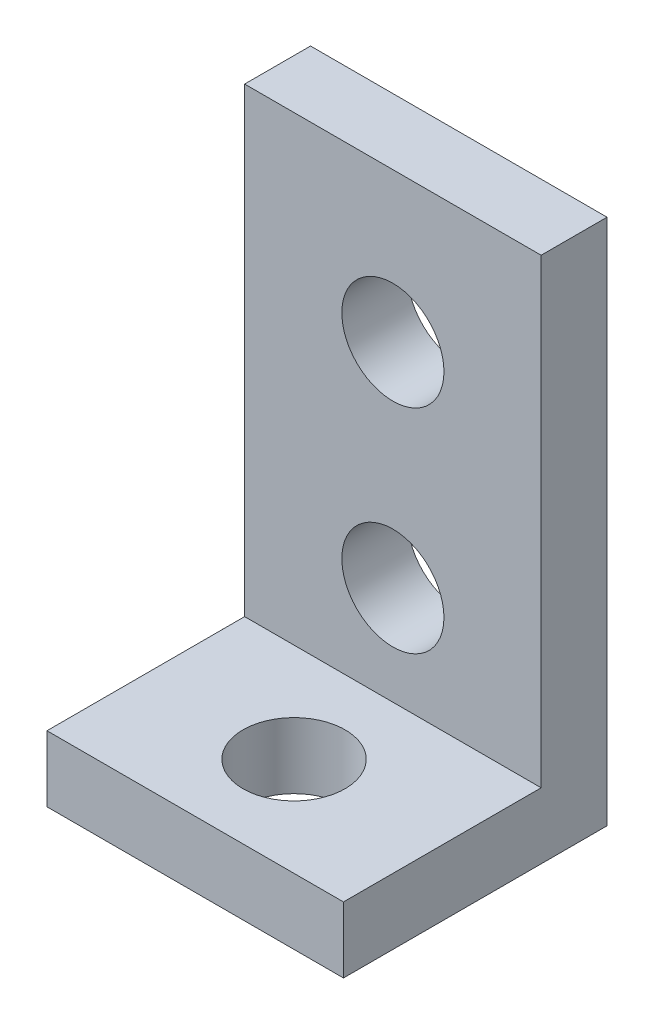
ISO-10303-21;
HEADER;
FILE_DESCRIPTION(('STEP AP214'),'2;1');
FILE_NAME('part.step','',(''),(''),'','','');
FILE_SCHEMA(('AUTOMOTIVE_DESIGN { 1 0 10303 214 1 1 1 1 }'));
ENDSEC;
DATA;
#1=APPLICATION_CONTEXT('core data for automotive mechanical design processes');
#2=APPLICATION_PROTOCOL_DEFINITION('international standard','automotive_design',2000,#1);
#3=PRODUCT_CONTEXT('',#1,'mechanical');
#4=PRODUCT('Part','Part','',(#3));
#5=PRODUCT_RELATED_PRODUCT_CATEGORY('part','',(#4));
#6=PRODUCT_DEFINITION_FORMATION('','',#4);
#7=PRODUCT_DEFINITION_CONTEXT('part definition',#1,'design');
#8=PRODUCT_DEFINITION('design','',#6,#7);
#9=PRODUCT_DEFINITION_SHAPE('','',#8);
#10=(LENGTH_UNIT() NAMED_UNIT(*) SI_UNIT(.MILLI.,.METRE.));
#11=(NAMED_UNIT(*) PLANE_ANGLE_UNIT() SI_UNIT($,.RADIAN.));
#12=(NAMED_UNIT(*) SI_UNIT($,.STERADIAN.) SOLID_ANGLE_UNIT());
#13=UNCERTAINTY_MEASURE_WITH_UNIT(LENGTH_MEASURE(1.E-05),#10,'distance_accuracy_value','');
#14=(GEOMETRIC_REPRESENTATION_CONTEXT(3) GLOBAL_UNCERTAINTY_ASSIGNED_CONTEXT((#13)) GLOBAL_UNIT_ASSIGNED_CONTEXT((#10,
#11,#12)) REPRESENTATION_CONTEXT('',''));
#15=CARTESIAN_POINT('',(0.,0.,0.));
#16=DIRECTION('',(0.,0.,1.));
#17=DIRECTION('',(1.,0.,0.));
#18=AXIS2_PLACEMENT_3D('',#15,#16,#17);
#19=CARTESIAN_POINT('',(9.,2.,0.));
#20=DIRECTION('',(0.,0.,-1.));
#21=DIRECTION('',(-1.,0.,0.));
#22=AXIS2_PLACEMENT_3D('',#19,#20,#21);
#23=PLANE('',#22);
#24=DIRECTION('',(0.,-1.,0.));
#25=VECTOR('',#24,1.);
#26=CARTESIAN_POINT('',(0.,2.,0.));
#27=LINE('',#26,#25);
#28=CARTESIAN_POINT('',(0.,2.,0.));
#29=VERTEX_POINT('',#28);
#30=CARTESIAN_POINT('',(0.,0.,0.));
#31=VERTEX_POINT('',#30);
#32=EDGE_CURVE('E184',#29,#31,#27,.T.);
#33=ORIENTED_EDGE('',*,*,#32,.T.);
#34=DIRECTION('',(-1.,0.,0.));
#35=VECTOR('',#34,1.);
#36=CARTESIAN_POINT('',(9.,0.,0.));
#37=LINE('',#36,#35);
#38=CARTESIAN_POINT('',(9.,0.,0.));
#39=VERTEX_POINT('',#38);
#40=EDGE_CURVE('E12',#39,#31,#37,.T.);
#41=ORIENTED_EDGE('',*,*,#40,.F.);
#42=DIRECTION('',(0.,-1.,0.));
#43=VECTOR('',#42,1.);
#44=CARTESIAN_POINT('',(9.,2.,0.));
#45=LINE('',#44,#43);
#46=CARTESIAN_POINT('',(9.,2.,0.));
#47=VERTEX_POINT('',#46);
#48=EDGE_CURVE('E201',#47,#39,#45,.T.);
#49=ORIENTED_EDGE('',*,*,#48,.F.);
#50=DIRECTION('',(-1.,0.,0.));
#51=VECTOR('',#50,1.);
#52=CARTESIAN_POINT('',(9.,2.,0.));
#53=LINE('',#52,#51);
#54=EDGE_CURVE('E180',#47,#29,#53,.T.);
#55=ORIENTED_EDGE('',*,*,#54,.T.);
#56=EDGE_LOOP('',(#33,#41,#49,#55));
#57=FACE_BOUND('',#56,.T.);
#58=ADVANCED_FACE('F93',(#57),#23,.F.);
#59=CARTESIAN_POINT('',(9.,0.,0.));
#60=DIRECTION('',(0.,1.,0.));
#61=DIRECTION('',(0.,0.,1.));
#62=AXIS2_PLACEMENT_3D('',#59,#60,#61);
#63=PLANE('',#62);
#64=CARTESIAN_POINT('',(4.5,0.,-3.));
#65=DIRECTION('',(0.,1.,0.));
#66=DIRECTION('',(0.,0.,1.));
#67=AXIS2_PLACEMENT_3D('',#64,#65,#66);
#68=CIRCLE('',#67,1.55);
#69=CARTESIAN_POINT('',(4.5,0.,-1.45));
#70=VERTEX_POINT('',#69);
#71=EDGE_CURVE('E189',#70,#70,#68,.T.);
#72=ORIENTED_EDGE('',*,*,#71,.T.);
#73=EDGE_LOOP('',(#72));
#74=FACE_BOUND('',#73,.T.);
#75=DIRECTION('',(0.,0.,-1.));
#76=VECTOR('',#75,1.);
#77=CARTESIAN_POINT('',(0.,0.,0.));
#78=LINE('',#77,#76);
#79=CARTESIAN_POINT('',(0.,0.,-8.));
#80=VERTEX_POINT('',#79);
#81=EDGE_CURVE('E188',#31,#80,#78,.T.);
#82=ORIENTED_EDGE('',*,*,#81,.T.);
#83=DIRECTION('',(-1.,0.,0.));
#84=VECTOR('',#83,1.);
#85=CARTESIAN_POINT('',(9.,0.,-8.));
#86=LINE('',#85,#84);
#87=CARTESIAN_POINT('',(9.,0.,-8.));
#88=VERTEX_POINT('',#87);
#89=EDGE_CURVE('E103',#88,#80,#86,.T.);
#90=ORIENTED_EDGE('',*,*,#89,.F.);
#91=DIRECTION('',(0.,0.,-1.));
#92=VECTOR('',#91,1.);
#93=CARTESIAN_POINT('',(9.,0.,0.));
#94=LINE('',#93,#92);
#95=EDGE_CURVE('E149',#39,#88,#94,.T.);
#96=ORIENTED_EDGE('',*,*,#95,.F.);
#97=ORIENTED_EDGE('',*,*,#40,.T.);
#98=EDGE_LOOP('',(#82,#90,#96,#97));
#99=FACE_BOUND('',#98,.T.);
#100=ADVANCED_FACE('F241',(#74,#99),#63,.F.);
#101=CARTESIAN_POINT('',(9.,0.,-8.));
#102=DIRECTION('',(0.,0.,1.));
#103=DIRECTION('',(1.,0.,0.));
#104=AXIS2_PLACEMENT_3D('',#101,#102,#103);
#105=PLANE('',#104);
#106=CARTESIAN_POINT('',(4.5,11.4635935668304,-8.));
#107=DIRECTION('',(0.,0.,1.));
#108=DIRECTION('',(1.,0.,0.));
#109=AXIS2_PLACEMENT_3D('',#106,#107,#108);
#110=CIRCLE('',#109,1.55);
#111=CARTESIAN_POINT('',(6.05,11.4635935668304,-8.));
#112=VERTEX_POINT('',#111);
#113=EDGE_CURVE('E213',#112,#112,#110,.T.);
#114=ORIENTED_EDGE('',*,*,#113,.T.);
#115=EDGE_LOOP('',(#114));
#116=FACE_BOUND('',#115,.T.);
#117=CARTESIAN_POINT('',(4.5,5.00158543209039,-8.));
#118=DIRECTION('',(0.,0.,1.));
#119=DIRECTION('',(1.,0.,0.));
#120=AXIS2_PLACEMENT_3D('',#117,#118,#119);
#121=CIRCLE('',#120,1.55);
#122=CARTESIAN_POINT('',(6.05,5.00158543209039,-8.));
#123=VERTEX_POINT('',#122);
#124=EDGE_CURVE('E221',#123,#123,#121,.T.);
#125=ORIENTED_EDGE('',*,*,#124,.T.);
#126=EDGE_LOOP('',(#125));
#127=FACE_BOUND('',#126,.T.);
#128=DIRECTION('',(0.,1.,0.));
#129=VECTOR('',#128,1.);
#130=CARTESIAN_POINT('',(0.,0.,-8.));
#131=LINE('',#130,#129);
#132=CARTESIAN_POINT('',(0.,16.,-8.));
#133=VERTEX_POINT('',#132);
#134=EDGE_CURVE('E192',#80,#133,#131,.T.);
#135=ORIENTED_EDGE('',*,*,#134,.T.);
#136=DIRECTION('',(-1.,0.,0.));
#137=VECTOR('',#136,1.);
#138=CARTESIAN_POINT('',(9.,16.,-8.));
#139=LINE('',#138,#137);
#140=CARTESIAN_POINT('',(9.,16.,-8.));
#141=VERTEX_POINT('',#140);
#142=EDGE_CURVE('E173',#141,#133,#139,.T.);
#143=ORIENTED_EDGE('',*,*,#142,.F.);
#144=DIRECTION('',(0.,1.,0.));
#145=VECTOR('',#144,1.);
#146=CARTESIAN_POINT('',(9.,0.,-8.));
#147=LINE('',#146,#145);
#148=EDGE_CURVE('E162',#88,#141,#147,.T.);
#149=ORIENTED_EDGE('',*,*,#148,.F.);
#150=ORIENTED_EDGE('',*,*,#89,.T.);
#151=EDGE_LOOP('',(#135,#143,#149,#150));
#152=FACE_BOUND('',#151,.T.);
#153=ADVANCED_FACE('F244',(#116,#127,#152),#105,.F.);
#154=CARTESIAN_POINT('',(9.,16.,-8.));
#155=DIRECTION('',(0.,-1.,0.));
#156=DIRECTION('',(0.,0.,-1.));
#157=AXIS2_PLACEMENT_3D('',#154,#155,#156);
#158=PLANE('',#157);
#159=DIRECTION('',(0.,0.,1.));
#160=VECTOR('',#159,1.);
#161=CARTESIAN_POINT('',(0.,16.,-8.));
#162=LINE('',#161,#160);
#163=CARTESIAN_POINT('',(0.,16.,-6.));
#164=VERTEX_POINT('',#163);
#165=EDGE_CURVE('E171',#133,#164,#162,.T.);
#166=ORIENTED_EDGE('',*,*,#165,.T.);
#167=DIRECTION('',(-1.,0.,0.));
#168=VECTOR('',#167,1.);
#169=CARTESIAN_POINT('',(9.,16.,-6.));
#170=LINE('',#169,#168);
#171=CARTESIAN_POINT('',(9.,16.,-6.));
#172=VERTEX_POINT('',#171);
#173=EDGE_CURVE('E168',#172,#164,#170,.T.);
#174=ORIENTED_EDGE('',*,*,#173,.F.);
#175=DIRECTION('',(0.,0.,1.));
#176=VECTOR('',#175,1.);
#177=CARTESIAN_POINT('',(9.,16.,-8.));
#178=LINE('',#177,#176);
#179=EDGE_CURVE('E156',#141,#172,#178,.T.);
#180=ORIENTED_EDGE('',*,*,#179,.F.);
#181=ORIENTED_EDGE('',*,*,#142,.T.);
#182=EDGE_LOOP('',(#166,#174,#180,#181));
#183=FACE_BOUND('',#182,.T.);
#184=ADVANCED_FACE('F169',(#183),#158,.F.);
#185=CARTESIAN_POINT('',(9.,16.,-6.));
#186=DIRECTION('',(0.,0.,-1.));
#187=DIRECTION('',(0.,1.,0.));
#188=AXIS2_PLACEMENT_3D('',#185,#186,#187);
#189=PLANE('',#188);
#190=CARTESIAN_POINT('',(4.5,11.4635935668304,-6.));
#191=DIRECTION('',(0.,0.,-1.));
#192=DIRECTION('',(0.,1.,0.));
#193=AXIS2_PLACEMENT_3D('',#190,#191,#192);
#194=CIRCLE('',#193,1.55);
#195=CARTESIAN_POINT('',(4.5,13.0135935668304,-6.));
#196=VERTEX_POINT('',#195);
#197=EDGE_CURVE('E96',#196,#196,#194,.T.);
#198=ORIENTED_EDGE('',*,*,#197,.T.);
#199=EDGE_LOOP('',(#198));
#200=FACE_BOUND('',#199,.T.);
#201=CARTESIAN_POINT('',(4.5,5.00158543209039,-6.));
#202=DIRECTION('',(0.,0.,-1.));
#203=DIRECTION('',(0.,1.,0.));
#204=AXIS2_PLACEMENT_3D('',#201,#202,#203);
#205=CIRCLE('',#204,1.55);
#206=CARTESIAN_POINT('',(4.5,6.55158543209039,-6.));
#207=VERTEX_POINT('',#206);
#208=EDGE_CURVE('E210',#207,#207,#205,.T.);
#209=ORIENTED_EDGE('',*,*,#208,.T.);
#210=EDGE_LOOP('',(#209));
#211=FACE_BOUND('',#210,.T.);
#212=DIRECTION('',(0.,-1.,0.));
#213=VECTOR('',#212,1.);
#214=CARTESIAN_POINT('',(0.,16.,-6.));
#215=LINE('',#214,#213);
#216=CARTESIAN_POINT('',(0.,2.,-6.));
#217=VERTEX_POINT('',#216);
#218=EDGE_CURVE('E135',#164,#217,#215,.T.);
#219=ORIENTED_EDGE('',*,*,#218,.T.);
#220=DIRECTION('',(-1.,0.,0.));
#221=VECTOR('',#220,1.);
#222=CARTESIAN_POINT('',(9.,2.,-6.));
#223=LINE('',#222,#221);
#224=CARTESIAN_POINT('',(9.,2.,-6.));
#225=VERTEX_POINT('',#224);
#226=EDGE_CURVE('E174',#225,#217,#223,.T.);
#227=ORIENTED_EDGE('',*,*,#226,.F.);
#228=DIRECTION('',(0.,-1.,0.));
#229=VECTOR('',#228,1.);
#230=CARTESIAN_POINT('',(9.,16.,-6.));
#231=LINE('',#230,#229);
#232=EDGE_CURVE('E160',#172,#225,#231,.T.);
#233=ORIENTED_EDGE('',*,*,#232,.F.);
#234=ORIENTED_EDGE('',*,*,#173,.T.);
#235=EDGE_LOOP('',(#219,#227,#233,#234));
#236=FACE_BOUND('',#235,.T.);
#237=ADVANCED_FACE('F176',(#200,#211,#236),#189,.F.);
#238=CARTESIAN_POINT('',(9.,2.,-6.));
#239=DIRECTION('',(0.,-1.,0.));
#240=DIRECTION('',(0.,0.,-1.));
#241=AXIS2_PLACEMENT_3D('',#238,#239,#240);
#242=PLANE('',#241);
#243=CARTESIAN_POINT('',(4.5,2.,-3.));
#244=DIRECTION('',(0.,1.,0.));
#245=DIRECTION('',(0.,0.,1.));
#246=AXIS2_PLACEMENT_3D('',#243,#244,#245);
#247=CIRCLE('',#246,1.55);
#248=CARTESIAN_POINT('',(4.5,2.,-1.45));
#249=VERTEX_POINT('',#248);
#250=EDGE_CURVE('E219',#249,#249,#247,.T.);
#251=ORIENTED_EDGE('',*,*,#250,.F.);
#252=EDGE_LOOP('',(#251));
#253=FACE_BOUND('',#252,.T.);
#254=DIRECTION('',(0.,0.,1.));
#255=VECTOR('',#254,1.);
#256=CARTESIAN_POINT('',(0.,2.,-6.));
#257=LINE('',#256,#255);
#258=EDGE_CURVE('E141',#217,#29,#257,.T.);
#259=ORIENTED_EDGE('',*,*,#258,.T.);
#260=ORIENTED_EDGE('',*,*,#54,.F.);
#261=DIRECTION('',(0.,0.,1.));
#262=VECTOR('',#261,1.);
#263=CARTESIAN_POINT('',(9.,2.,-6.));
#264=LINE('',#263,#262);
#265=EDGE_CURVE('E112',#225,#47,#264,.T.);
#266=ORIENTED_EDGE('',*,*,#265,.F.);
#267=ORIENTED_EDGE('',*,*,#226,.T.);
#268=EDGE_LOOP('',(#259,#260,#266,#267));
#269=FACE_BOUND('',#268,.T.);
#270=ADVANCED_FACE('F249',(#253,#269),#242,.F.);
#271=CARTESIAN_POINT('',(9.,0.,0.));
#272=DIRECTION('',(1.,0.,0.));
#273=DIRECTION('',(0.,0.,-1.));
#274=AXIS2_PLACEMENT_3D('',#271,#272,#273);
#275=PLANE('',#274);
#276=ORIENTED_EDGE('',*,*,#48,.T.);
#277=ORIENTED_EDGE('',*,*,#95,.T.);
#278=ORIENTED_EDGE('',*,*,#148,.T.);
#279=ORIENTED_EDGE('',*,*,#179,.T.);
#280=ORIENTED_EDGE('',*,*,#232,.T.);
#281=ORIENTED_EDGE('',*,*,#265,.T.);
#282=EDGE_LOOP('',(#276,#277,#278,#279,#280,#281));
#283=FACE_BOUND('',#282,.T.);
#284=ADVANCED_FACE('F158',(#283),#275,.T.);
#285=CARTESIAN_POINT('',(0.,0.,0.));
#286=DIRECTION('',(1.,0.,0.));
#287=DIRECTION('',(0.,0.,-1.));
#288=AXIS2_PLACEMENT_3D('',#285,#286,#287);
#289=PLANE('',#288);
#290=ORIENTED_EDGE('',*,*,#32,.F.);
#291=ORIENTED_EDGE('',*,*,#258,.F.);
#292=ORIENTED_EDGE('',*,*,#218,.F.);
#293=ORIENTED_EDGE('',*,*,#165,.F.);
#294=ORIENTED_EDGE('',*,*,#134,.F.);
#295=ORIENTED_EDGE('',*,*,#81,.F.);
#296=EDGE_LOOP('',(#290,#291,#292,#293,#294,#295));
#297=FACE_BOUND('',#296,.T.);
#298=ADVANCED_FACE('F247',(#297),#289,.F.);
#299=CARTESIAN_POINT('',(4.5,2.,-3.));
#300=DIRECTION('',(0.,-1.,0.));
#301=DIRECTION('',(0.,0.,-1.));
#302=AXIS2_PLACEMENT_3D('',#299,#300,#301);
#303=CYLINDRICAL_SURFACE('',#302,1.55);
#304=ORIENTED_EDGE('',*,*,#250,.T.);
#305=EDGE_LOOP('',(#304));
#306=FACE_BOUND('',#305,.T.);
#307=ORIENTED_EDGE('',*,*,#71,.F.);
#308=EDGE_LOOP('',(#307));
#309=FACE_BOUND('',#308,.T.);
#310=ADVANCED_FACE('F298',(#306,#309),#303,.F.);
#311=CARTESIAN_POINT('',(4.5,5.00158543209039,-8.));
#312=DIRECTION('',(0.,0.,1.));
#313=DIRECTION('',(0.,-1.,0.));
#314=AXIS2_PLACEMENT_3D('',#311,#312,#313);
#315=CYLINDRICAL_SURFACE('',#314,1.55);
#316=ORIENTED_EDGE('',*,*,#124,.F.);
#317=EDGE_LOOP('',(#316));
#318=FACE_BOUND('',#317,.T.);
#319=ORIENTED_EDGE('',*,*,#208,.F.);
#320=EDGE_LOOP('',(#319));
#321=FACE_BOUND('',#320,.T.);
#322=ADVANCED_FACE('F292',(#318,#321),#315,.F.);
#323=CARTESIAN_POINT('',(4.5,11.4635935668304,-8.));
#324=DIRECTION('',(0.,0.,1.));
#325=DIRECTION('',(0.,-1.,0.));
#326=AXIS2_PLACEMENT_3D('',#323,#324,#325);
#327=CYLINDRICAL_SURFACE('',#326,1.55);
#328=ORIENTED_EDGE('',*,*,#113,.F.);
#329=EDGE_LOOP('',(#328));
#330=FACE_BOUND('',#329,.T.);
#331=ORIENTED_EDGE('',*,*,#197,.F.);
#332=EDGE_LOOP('',(#331));
#333=FACE_BOUND('',#332,.T.);
#334=ADVANCED_FACE('F297',(#330,#333),#327,.F.);
#335=CLOSED_SHELL('',(#58,#100,#153,#184,#237,#270,#284,#298,#310,#322,#334));
#336=MANIFOLD_SOLID_BREP('B2',#335);
#337=ADVANCED_BREP_SHAPE_REPRESENTATION('',(#18,#336),#14);
#338=SHAPE_DEFINITION_REPRESENTATION(#9,#337);
ENDSEC;
END-ISO-10303-21;
